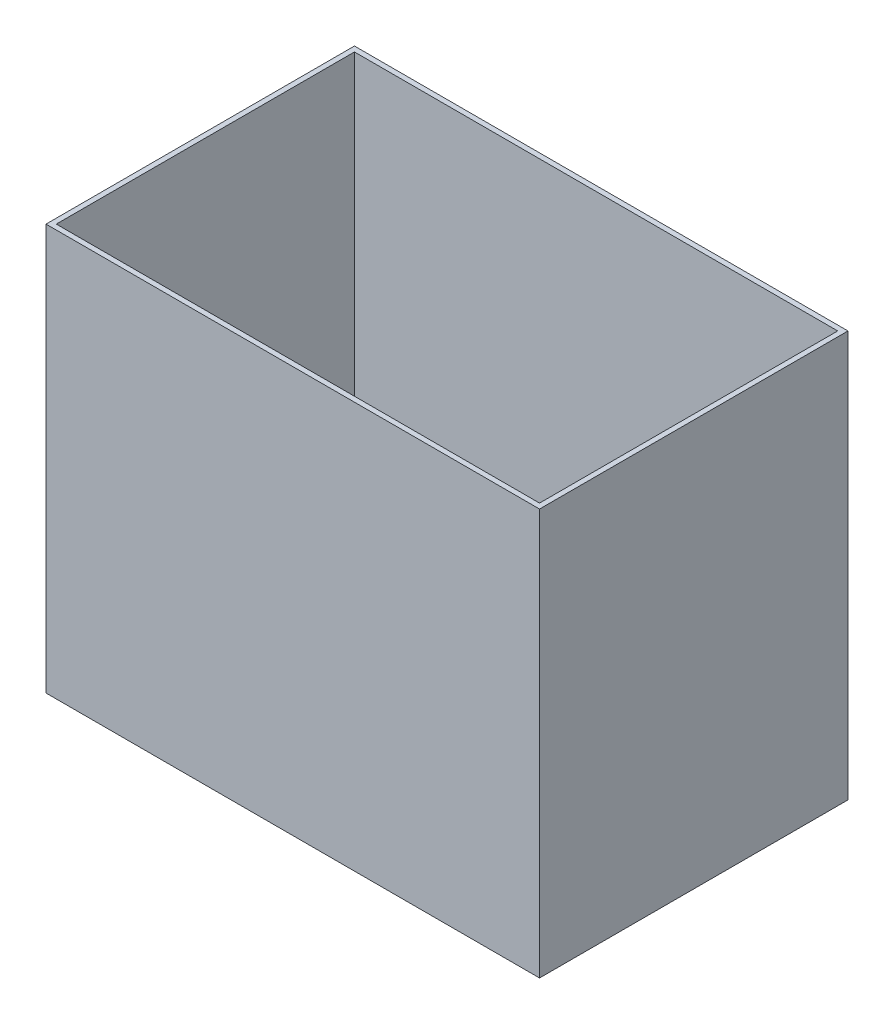
ISO-10303-21;
HEADER;
FILE_DESCRIPTION(('STEP AP214'),'2;1');
FILE_NAME('part.step','',(''),(''),'','','');
FILE_SCHEMA(('AUTOMOTIVE_DESIGN { 1 0 10303 214 1 1 1 1 }'));
ENDSEC;
DATA;
#1=APPLICATION_CONTEXT('core data for automotive mechanical design processes');
#2=APPLICATION_PROTOCOL_DEFINITION('international standard','automotive_design',2000,#1);
#3=PRODUCT_CONTEXT('',#1,'mechanical');
#4=PRODUCT('Part','Part','',(#3));
#5=PRODUCT_RELATED_PRODUCT_CATEGORY('part','',(#4));
#6=PRODUCT_DEFINITION_FORMATION('','',#4);
#7=PRODUCT_DEFINITION_CONTEXT('part definition',#1,'design');
#8=PRODUCT_DEFINITION('design','',#6,#7);
#9=PRODUCT_DEFINITION_SHAPE('','',#8);
#10=(LENGTH_UNIT() NAMED_UNIT(*) SI_UNIT(.MILLI.,.METRE.));
#11=(NAMED_UNIT(*) PLANE_ANGLE_UNIT() SI_UNIT($,.RADIAN.));
#12=(NAMED_UNIT(*) SI_UNIT($,.STERADIAN.) SOLID_ANGLE_UNIT());
#13=UNCERTAINTY_MEASURE_WITH_UNIT(LENGTH_MEASURE(1.E-05),#10,'distance_accuracy_value','');
#14=(GEOMETRIC_REPRESENTATION_CONTEXT(3) GLOBAL_UNCERTAINTY_ASSIGNED_CONTEXT((#13)) GLOBAL_UNIT_ASSIGNED_CONTEXT((#10,
#11,#12)) REPRESENTATION_CONTEXT('',''));
#15=CARTESIAN_POINT('',(0.,0.,0.));
#16=DIRECTION('',(0.,0.,1.));
#17=DIRECTION('',(1.,0.,0.));
#18=AXIS2_PLACEMENT_3D('',#15,#16,#17);
#19=CARTESIAN_POINT('',(0.,5.,0.));
#20=DIRECTION('',(1.,0.,0.));
#21=DIRECTION('',(0.,0.,-1.));
#22=AXIS2_PLACEMENT_3D('',#19,#20,#21);
#23=PLANE('',#22);
#24=DIRECTION('',(0.,0.,1.));
#25=VECTOR('',#24,1.);
#26=CARTESIAN_POINT('',(0.,0.,0.));
#27=LINE('',#26,#25);
#28=CARTESIAN_POINT('',(0.,0.,0.));
#29=VERTEX_POINT('',#28);
#30=CARTESIAN_POINT('',(0.,0.,300.));
#31=VERTEX_POINT('',#30);
#32=EDGE_CURVE('E144',#29,#31,#27,.T.);
#33=ORIENTED_EDGE('',*,*,#32,.T.);
#34=DIRECTION('',(0.,-1.,0.));
#35=VECTOR('',#34,1.);
#36=CARTESIAN_POINT('',(0.,5.,300.));
#37=LINE('',#36,#35);
#38=CARTESIAN_POINT('',(0.,395.,300.));
#39=VERTEX_POINT('',#38);
#40=EDGE_CURVE('E11',#39,#31,#37,.T.);
#41=ORIENTED_EDGE('',*,*,#40,.F.);
#42=DIRECTION('',(0.,0.,1.));
#43=VECTOR('',#42,1.);
#44=CARTESIAN_POINT('',(0.,395.,0.));
#45=LINE('',#44,#43);
#46=CARTESIAN_POINT('',(0.,395.,0.));
#47=VERTEX_POINT('',#46);
#48=EDGE_CURVE('E111',#47,#39,#45,.T.);
#49=ORIENTED_EDGE('',*,*,#48,.F.);
#50=DIRECTION('',(0.,-1.,0.));
#51=VECTOR('',#50,1.);
#52=CARTESIAN_POINT('',(0.,5.,0.));
#53=LINE('',#52,#51);
#54=EDGE_CURVE('E153',#47,#29,#53,.T.);
#55=ORIENTED_EDGE('',*,*,#54,.T.);
#56=EDGE_LOOP('',(#33,#41,#49,#55));
#57=FACE_BOUND('',#56,.T.);
#58=ADVANCED_FACE('F33',(#57),#23,.F.);
#59=CARTESIAN_POINT('',(0.,5.,300.));
#60=DIRECTION('',(0.,0.,-1.));
#61=DIRECTION('',(-1.,0.,0.));
#62=AXIS2_PLACEMENT_3D('',#59,#60,#61);
#63=PLANE('',#62);
#64=DIRECTION('',(1.,0.,0.));
#65=VECTOR('',#64,1.);
#66=CARTESIAN_POINT('',(0.,0.,300.));
#67=LINE('',#66,#65);
#68=CARTESIAN_POINT('',(480.,0.,300.));
#69=VERTEX_POINT('',#68);
#70=EDGE_CURVE('E147',#31,#69,#67,.T.);
#71=ORIENTED_EDGE('',*,*,#70,.T.);
#72=DIRECTION('',(0.,-1.,0.));
#73=VECTOR('',#72,1.);
#74=CARTESIAN_POINT('',(480.,5.,300.));
#75=LINE('',#74,#73);
#76=CARTESIAN_POINT('',(480.,395.,300.));
#77=VERTEX_POINT('',#76);
#78=EDGE_CURVE('E40',#77,#69,#75,.T.);
#79=ORIENTED_EDGE('',*,*,#78,.F.);
#80=DIRECTION('',(1.,0.,0.));
#81=VECTOR('',#80,1.);
#82=CARTESIAN_POINT('',(0.,395.,300.));
#83=LINE('',#82,#81);
#84=EDGE_CURVE('E135',#39,#77,#83,.T.);
#85=ORIENTED_EDGE('',*,*,#84,.F.);
#86=ORIENTED_EDGE('',*,*,#40,.T.);
#87=EDGE_LOOP('',(#71,#79,#85,#86));
#88=FACE_BOUND('',#87,.T.);
#89=ADVANCED_FACE('F175',(#88),#63,.F.);
#90=CARTESIAN_POINT('',(480.,5.,0.));
#91=DIRECTION('',(-1.,0.,0.));
#92=DIRECTION('',(0.,0.,1.));
#93=AXIS2_PLACEMENT_3D('',#90,#91,#92);
#94=PLANE('',#93);
#95=DIRECTION('',(0.,0.,-1.));
#96=VECTOR('',#95,1.);
#97=CARTESIAN_POINT('',(480.,0.,0.));
#98=LINE('',#97,#96);
#99=CARTESIAN_POINT('',(480.,0.,0.));
#100=VERTEX_POINT('',#99);
#101=EDGE_CURVE('E149',#69,#100,#98,.T.);
#102=ORIENTED_EDGE('',*,*,#101,.T.);
#103=DIRECTION('',(0.,-1.,0.));
#104=VECTOR('',#103,1.);
#105=CARTESIAN_POINT('',(480.,5.,0.));
#106=LINE('',#105,#104);
#107=CARTESIAN_POINT('',(480.,395.,0.));
#108=VERTEX_POINT('',#107);
#109=EDGE_CURVE('E156',#108,#100,#106,.T.);
#110=ORIENTED_EDGE('',*,*,#109,.F.);
#111=DIRECTION('',(0.,0.,-1.));
#112=VECTOR('',#111,1.);
#113=CARTESIAN_POINT('',(480.,395.,0.));
#114=LINE('',#113,#112);
#115=EDGE_CURVE('E138',#77,#108,#114,.T.);
#116=ORIENTED_EDGE('',*,*,#115,.F.);
#117=ORIENTED_EDGE('',*,*,#78,.T.);
#118=EDGE_LOOP('',(#102,#110,#116,#117));
#119=FACE_BOUND('',#118,.T.);
#120=ADVANCED_FACE('F162',(#119),#94,.F.);
#121=CARTESIAN_POINT('',(0.,5.,0.));
#122=DIRECTION('',(0.,0.,1.));
#123=DIRECTION('',(1.,0.,0.));
#124=AXIS2_PLACEMENT_3D('',#121,#122,#123);
#125=PLANE('',#124);
#126=DIRECTION('',(-1.,0.,0.));
#127=VECTOR('',#126,1.);
#128=CARTESIAN_POINT('',(0.,0.,0.));
#129=LINE('',#128,#127);
#130=EDGE_CURVE('E151',#100,#29,#129,.T.);
#131=ORIENTED_EDGE('',*,*,#130,.T.);
#132=ORIENTED_EDGE('',*,*,#54,.F.);
#133=DIRECTION('',(-1.,0.,0.));
#134=VECTOR('',#133,1.);
#135=CARTESIAN_POINT('',(0.,395.,0.));
#136=LINE('',#135,#134);
#137=EDGE_CURVE('E141',#108,#47,#136,.T.);
#138=ORIENTED_EDGE('',*,*,#137,.F.);
#139=ORIENTED_EDGE('',*,*,#109,.T.);
#140=EDGE_LOOP('',(#131,#132,#138,#139));
#141=FACE_BOUND('',#140,.T.);
#142=ADVANCED_FACE('F170',(#141),#125,.F.);
#143=CARTESIAN_POINT('',(0.,0.,0.));
#144=DIRECTION('',(0.,1.,0.));
#145=DIRECTION('',(0.,0.,1.));
#146=AXIS2_PLACEMENT_3D('',#143,#144,#145);
#147=PLANE('',#146);
#148=ORIENTED_EDGE('',*,*,#32,.F.);
#149=ORIENTED_EDGE('',*,*,#130,.F.);
#150=ORIENTED_EDGE('',*,*,#101,.F.);
#151=ORIENTED_EDGE('',*,*,#70,.F.);
#152=EDGE_LOOP('',(#148,#149,#150,#151));
#153=FACE_BOUND('',#152,.T.);
#154=ADVANCED_FACE('F168',(#153),#147,.F.);
#155=CARTESIAN_POINT('',(0.,395.,0.));
#156=DIRECTION('',(0.,1.,0.));
#157=DIRECTION('',(0.,0.,1.));
#158=AXIS2_PLACEMENT_3D('',#155,#156,#157);
#159=PLANE('',#158);
#160=ORIENTED_EDGE('',*,*,#48,.T.);
#161=ORIENTED_EDGE('',*,*,#84,.T.);
#162=ORIENTED_EDGE('',*,*,#115,.T.);
#163=ORIENTED_EDGE('',*,*,#137,.T.);
#164=EDGE_LOOP('',(#160,#161,#162,#163));
#165=FACE_BOUND('',#164,.T.);
#166=DIRECTION('',(0.,0.,1.));
#167=VECTOR('',#166,1.);
#168=CARTESIAN_POINT('',(5.,395.,5.));
#169=LINE('',#168,#167);
#170=CARTESIAN_POINT('',(5.,395.,5.));
#171=VERTEX_POINT('',#170);
#172=CARTESIAN_POINT('',(5.,395.,295.));
#173=VERTEX_POINT('',#172);
#174=EDGE_CURVE('E105',#171,#173,#169,.T.);
#175=ORIENTED_EDGE('',*,*,#174,.F.);
#176=DIRECTION('',(-1.,0.,0.));
#177=VECTOR('',#176,1.);
#178=CARTESIAN_POINT('',(5.,395.,5.));
#179=LINE('',#178,#177);
#180=CARTESIAN_POINT('',(475.,395.,5.));
#181=VERTEX_POINT('',#180);
#182=EDGE_CURVE('E96',#181,#171,#179,.T.);
#183=ORIENTED_EDGE('',*,*,#182,.F.);
#184=DIRECTION('',(0.,0.,-1.));
#185=VECTOR('',#184,1.);
#186=CARTESIAN_POINT('',(475.,395.,5.));
#187=LINE('',#186,#185);
#188=CARTESIAN_POINT('',(475.,395.,295.));
#189=VERTEX_POINT('',#188);
#190=EDGE_CURVE('E119',#189,#181,#187,.T.);
#191=ORIENTED_EDGE('',*,*,#190,.F.);
#192=DIRECTION('',(1.,0.,0.));
#193=VECTOR('',#192,1.);
#194=CARTESIAN_POINT('',(5.,395.,295.));
#195=LINE('',#194,#193);
#196=EDGE_CURVE('E117',#173,#189,#195,.T.);
#197=ORIENTED_EDGE('',*,*,#196,.F.);
#198=EDGE_LOOP('',(#175,#183,#191,#197));
#199=FACE_BOUND('',#198,.T.);
#200=ADVANCED_FACE('F115',(#165,#199),#159,.T.);
#201=CARTESIAN_POINT('',(5.,395.,5.));
#202=DIRECTION('',(0.,0.,1.));
#203=DIRECTION('',(1.,0.,0.));
#204=AXIS2_PLACEMENT_3D('',#201,#202,#203);
#205=PLANE('',#204);
#206=DIRECTION('',(-1.,0.,0.));
#207=VECTOR('',#206,1.);
#208=CARTESIAN_POINT('',(5.,5.,5.));
#209=LINE('',#208,#207);
#210=CARTESIAN_POINT('',(475.,5.,5.));
#211=VERTEX_POINT('',#210);
#212=CARTESIAN_POINT('',(5.,5.,5.));
#213=VERTEX_POINT('',#212);
#214=EDGE_CURVE('E47',#211,#213,#209,.T.);
#215=ORIENTED_EDGE('',*,*,#214,.F.);
#216=DIRECTION('',(0.,-1.,0.));
#217=VECTOR('',#216,1.);
#218=CARTESIAN_POINT('',(475.,395.,5.));
#219=LINE('',#218,#217);
#220=EDGE_CURVE('E101',#181,#211,#219,.T.);
#221=ORIENTED_EDGE('',*,*,#220,.F.);
#222=ORIENTED_EDGE('',*,*,#182,.T.);
#223=DIRECTION('',(0.,-1.,0.));
#224=VECTOR('',#223,1.);
#225=CARTESIAN_POINT('',(5.,395.,5.));
#226=LINE('',#225,#224);
#227=EDGE_CURVE('E99',#171,#213,#226,.T.);
#228=ORIENTED_EDGE('',*,*,#227,.T.);
#229=EDGE_LOOP('',(#215,#221,#222,#228));
#230=FACE_BOUND('',#229,.T.);
#231=ADVANCED_FACE('F98',(#230),#205,.T.);
#232=CARTESIAN_POINT('',(5.,395.,5.));
#233=DIRECTION('',(1.,0.,0.));
#234=DIRECTION('',(0.,0.,-1.));
#235=AXIS2_PLACEMENT_3D('',#232,#233,#234);
#236=PLANE('',#235);
#237=DIRECTION('',(0.,0.,1.));
#238=VECTOR('',#237,1.);
#239=CARTESIAN_POINT('',(5.,5.,5.));
#240=LINE('',#239,#238);
#241=CARTESIAN_POINT('',(5.,5.,295.));
#242=VERTEX_POINT('',#241);
#243=EDGE_CURVE('E51',#213,#242,#240,.T.);
#244=ORIENTED_EDGE('',*,*,#243,.F.);
#245=ORIENTED_EDGE('',*,*,#227,.F.);
#246=ORIENTED_EDGE('',*,*,#174,.T.);
#247=DIRECTION('',(0.,-1.,0.));
#248=VECTOR('',#247,1.);
#249=CARTESIAN_POINT('',(5.,395.,295.));
#250=LINE('',#249,#248);
#251=EDGE_CURVE('E112',#173,#242,#250,.T.);
#252=ORIENTED_EDGE('',*,*,#251,.T.);
#253=EDGE_LOOP('',(#244,#245,#246,#252));
#254=FACE_BOUND('',#253,.T.);
#255=ADVANCED_FACE('F109',(#254),#236,.T.);
#256=CARTESIAN_POINT('',(5.,395.,295.));
#257=DIRECTION('',(0.,0.,-1.));
#258=DIRECTION('',(-1.,0.,0.));
#259=AXIS2_PLACEMENT_3D('',#256,#257,#258);
#260=PLANE('',#259);
#261=DIRECTION('',(1.,0.,0.));
#262=VECTOR('',#261,1.);
#263=CARTESIAN_POINT('',(5.,5.,295.));
#264=LINE('',#263,#262);
#265=CARTESIAN_POINT('',(475.,5.,295.));
#266=VERTEX_POINT('',#265);
#267=EDGE_CURVE('E125',#242,#266,#264,.T.);
#268=ORIENTED_EDGE('',*,*,#267,.F.);
#269=ORIENTED_EDGE('',*,*,#251,.F.);
#270=ORIENTED_EDGE('',*,*,#196,.T.);
#271=DIRECTION('',(0.,-1.,0.));
#272=VECTOR('',#271,1.);
#273=CARTESIAN_POINT('',(475.,395.,295.));
#274=LINE('',#273,#272);
#275=EDGE_CURVE('E129',#189,#266,#274,.T.);
#276=ORIENTED_EDGE('',*,*,#275,.T.);
#277=EDGE_LOOP('',(#268,#269,#270,#276));
#278=FACE_BOUND('',#277,.T.);
#279=ADVANCED_FACE('F197',(#278),#260,.T.);
#280=CARTESIAN_POINT('',(475.,395.,5.));
#281=DIRECTION('',(-1.,0.,0.));
#282=DIRECTION('',(0.,0.,1.));
#283=AXIS2_PLACEMENT_3D('',#280,#281,#282);
#284=PLANE('',#283);
#285=DIRECTION('',(0.,0.,-1.));
#286=VECTOR('',#285,1.);
#287=CARTESIAN_POINT('',(475.,5.,5.));
#288=LINE('',#287,#286);
#289=EDGE_CURVE('E106',#266,#211,#288,.T.);
#290=ORIENTED_EDGE('',*,*,#289,.F.);
#291=ORIENTED_EDGE('',*,*,#275,.F.);
#292=ORIENTED_EDGE('',*,*,#190,.T.);
#293=ORIENTED_EDGE('',*,*,#220,.T.);
#294=EDGE_LOOP('',(#290,#291,#292,#293));
#295=FACE_BOUND('',#294,.T.);
#296=ADVANCED_FACE('F190',(#295),#284,.T.);
#297=CARTESIAN_POINT('',(0.,5.,0.));
#298=DIRECTION('',(0.,1.,0.));
#299=DIRECTION('',(0.,0.,1.));
#300=AXIS2_PLACEMENT_3D('',#297,#298,#299);
#301=PLANE('',#300);
#302=ORIENTED_EDGE('',*,*,#214,.T.);
#303=ORIENTED_EDGE('',*,*,#243,.T.);
#304=ORIENTED_EDGE('',*,*,#267,.T.);
#305=ORIENTED_EDGE('',*,*,#289,.T.);
#306=EDGE_LOOP('',(#302,#303,#304,#305));
#307=FACE_BOUND('',#306,.T.);
#308=ADVANCED_FACE('F187',(#307),#301,.T.);
#309=CLOSED_SHELL('',(#58,#89,#120,#142,#154,#200,#231,#255,#279,#296,#308));
#310=MANIFOLD_SOLID_BREP('B2',#309);
#311=ADVANCED_BREP_SHAPE_REPRESENTATION('',(#18,#310),#14);
#312=SHAPE_DEFINITION_REPRESENTATION(#9,#311);
ENDSEC;
END-ISO-10303-21;
